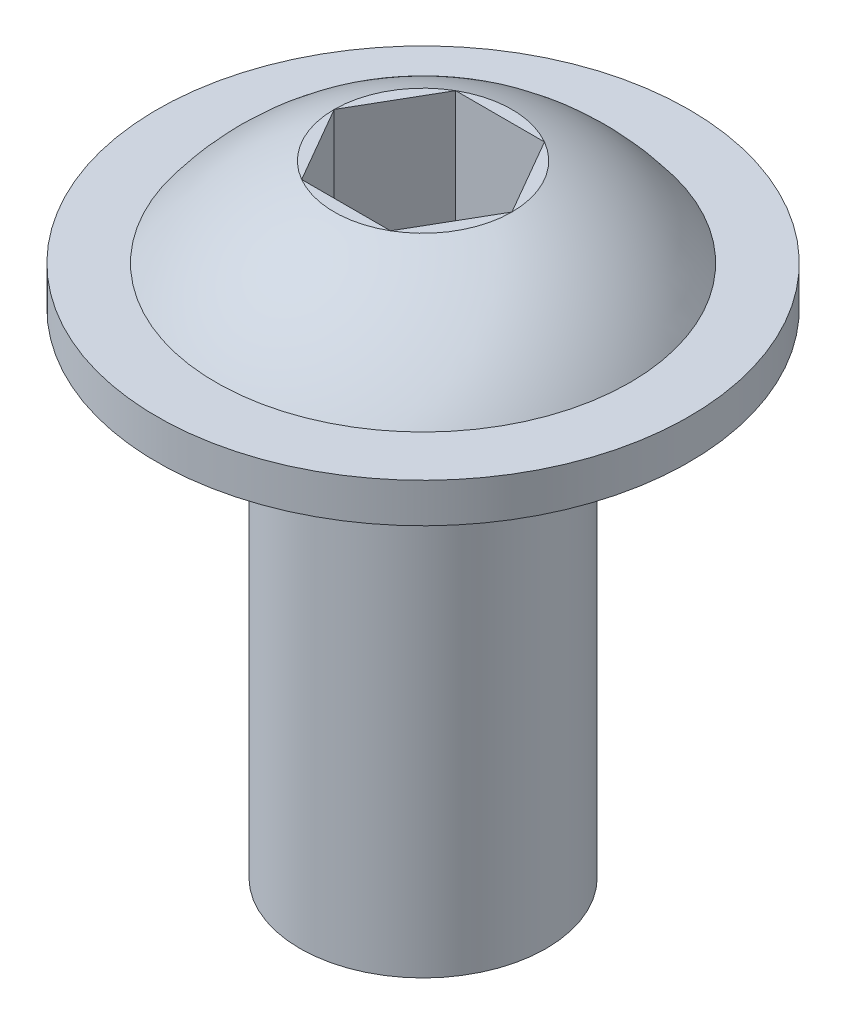
ISO-10303-21;
HEADER;
FILE_DESCRIPTION(('STEP AP214'),'2;1');
FILE_NAME('part.step','',(''),(''),'','','');
FILE_SCHEMA(('AUTOMOTIVE_DESIGN { 1 0 10303 214 1 1 1 1 }'));
ENDSEC;
DATA;
#1=APPLICATION_CONTEXT('core data for automotive mechanical design processes');
#2=APPLICATION_PROTOCOL_DEFINITION('international standard','automotive_design',2000,#1);
#3=PRODUCT_CONTEXT('',#1,'mechanical');
#4=PRODUCT('Part','Part','',(#3));
#5=PRODUCT_RELATED_PRODUCT_CATEGORY('part','',(#4));
#6=PRODUCT_DEFINITION_FORMATION('','',#4);
#7=PRODUCT_DEFINITION_CONTEXT('part definition',#1,'design');
#8=PRODUCT_DEFINITION('design','',#6,#7);
#9=PRODUCT_DEFINITION_SHAPE('','',#8);
#10=(LENGTH_UNIT() NAMED_UNIT(*) SI_UNIT(.MILLI.,.METRE.));
#11=(NAMED_UNIT(*) PLANE_ANGLE_UNIT() SI_UNIT($,.RADIAN.));
#12=(NAMED_UNIT(*) SI_UNIT($,.STERADIAN.) SOLID_ANGLE_UNIT());
#13=UNCERTAINTY_MEASURE_WITH_UNIT(LENGTH_MEASURE(1.E-05),#10,'distance_accuracy_value','');
#14=(GEOMETRIC_REPRESENTATION_CONTEXT(3) GLOBAL_UNCERTAINTY_ASSIGNED_CONTEXT((#13)) GLOBAL_UNIT_ASSIGNED_CONTEXT((#10,
#11,#12)) REPRESENTATION_CONTEXT('',''));
#15=CARTESIAN_POINT('',(0.,0.,0.));
#16=DIRECTION('',(0.,0.,1.));
#17=DIRECTION('',(1.,0.,0.));
#18=AXIS2_PLACEMENT_3D('',#15,#16,#17);
#19=CARTESIAN_POINT('',(2.29135888084633,16.002,0.));
#20=DIRECTION('',(0.,1.,0.));
#21=DIRECTION('',(0.,0.,1.));
#22=AXIS2_PLACEMENT_3D('',#19,#20,#21);
#23=PLANE('',#22);
#24=DIRECTION('',(0.5,0.,-0.866025403784439));
#25=VECTOR('',#24,1.);
#26=CARTESIAN_POINT('',(1.14567944042316,16.002,1.984375));
#27=LINE('',#26,#25);
#28=CARTESIAN_POINT('',(1.14567944042316,16.002,1.984375));
#29=VERTEX_POINT('',#28);
#30=CARTESIAN_POINT('',(2.29135888084633,16.002,0.));
#31=VERTEX_POINT('',#30);
#32=EDGE_CURVE('E47',#29,#31,#27,.T.);
#33=ORIENTED_EDGE('',*,*,#32,.F.);
#34=CARTESIAN_POINT('',(0.,16.002,0.));
#35=DIRECTION('',(0.,-1.,0.));
#36=DIRECTION('',(0.,0.,-1.));
#37=AXIS2_PLACEMENT_3D('',#34,#35,#36);
#38=CIRCLE('',#37,2.29135888084633);
#39=EDGE_CURVE('E144',#31,#29,#38,.T.);
#40=ORIENTED_EDGE('',*,*,#39,.F.);
#41=EDGE_LOOP('',(#33,#40));
#42=FACE_BOUND('',#41,.T.);
#43=ADVANCED_FACE('F32',(#42),#23,.T.);
#44=DIRECTION('',(1.,0.,0.));
#45=VECTOR('',#44,1.);
#46=CARTESIAN_POINT('',(-1.14567944042316,16.002,1.984375));
#47=LINE('',#46,#45);
#48=CARTESIAN_POINT('',(-1.14567944042316,16.002,1.984375));
#49=VERTEX_POINT('',#48);
#50=EDGE_CURVE('E130',#49,#29,#47,.T.);
#51=ORIENTED_EDGE('',*,*,#50,.F.);
#52=EDGE_CURVE('E218',#29,#49,#38,.T.);
#53=ORIENTED_EDGE('',*,*,#52,.F.);
#54=EDGE_LOOP('',(#51,#53));
#55=FACE_BOUND('',#54,.T.);
#56=ADVANCED_FACE('F171',(#55),#23,.T.);
#57=DIRECTION('',(0.5,0.,0.866025403784438));
#58=VECTOR('',#57,1.);
#59=CARTESIAN_POINT('',(-2.29135888084633,16.002,0.));
#60=LINE('',#59,#58);
#61=CARTESIAN_POINT('',(-2.29135888084633,16.002,0.));
#62=VERTEX_POINT('',#61);
#63=EDGE_CURVE('E128',#62,#49,#60,.T.);
#64=ORIENTED_EDGE('',*,*,#63,.F.);
#65=EDGE_CURVE('E219',#49,#62,#38,.T.);
#66=ORIENTED_EDGE('',*,*,#65,.F.);
#67=EDGE_LOOP('',(#64,#66));
#68=FACE_BOUND('',#67,.T.);
#69=ADVANCED_FACE('F178',(#68),#23,.T.);
#70=DIRECTION('',(-0.5,0.,0.866025403784439));
#71=VECTOR('',#70,1.);
#72=CARTESIAN_POINT('',(-1.14567944042316,16.002,-1.984375));
#73=LINE('',#72,#71);
#74=CARTESIAN_POINT('',(-1.14567944042316,16.002,-1.984375));
#75=VERTEX_POINT('',#74);
#76=EDGE_CURVE('E95',#75,#62,#73,.T.);
#77=ORIENTED_EDGE('',*,*,#76,.F.);
#78=EDGE_CURVE('E213',#62,#75,#38,.T.);
#79=ORIENTED_EDGE('',*,*,#78,.F.);
#80=EDGE_LOOP('',(#77,#79));
#81=FACE_BOUND('',#80,.T.);
#82=ADVANCED_FACE('F195',(#81),#23,.T.);
#83=DIRECTION('',(-1.,0.,0.));
#84=VECTOR('',#83,1.);
#85=CARTESIAN_POINT('',(1.14567944042316,16.002,-1.984375));
#86=LINE('',#85,#84);
#87=CARTESIAN_POINT('',(1.14567944042316,16.002,-1.984375));
#88=VERTEX_POINT('',#87);
#89=EDGE_CURVE('E124',#88,#75,#86,.T.);
#90=ORIENTED_EDGE('',*,*,#89,.F.);
#91=EDGE_CURVE('E134',#75,#88,#38,.T.);
#92=ORIENTED_EDGE('',*,*,#91,.F.);
#93=EDGE_LOOP('',(#90,#92));
#94=FACE_BOUND('',#93,.T.);
#95=ADVANCED_FACE('F186',(#94),#23,.T.);
#96=CARTESIAN_POINT('',(0.,0.,0.));
#97=DIRECTION('',(0.,-1.,0.));
#98=DIRECTION('',(0.,0.,-1.));
#99=AXIS2_PLACEMENT_3D('',#96,#97,#98);
#100=PLANE('',#99);
#101=CARTESIAN_POINT('',(0.,0.,0.));
#102=DIRECTION('',(0.,-1.,0.));
#103=DIRECTION('',(0.,0.,-1.));
#104=AXIS2_PLACEMENT_3D('',#101,#102,#103);
#105=CIRCLE('',#104,3.175);
#106=CARTESIAN_POINT('',(0.,0.,-3.175));
#107=VERTEX_POINT('',#106);
#108=EDGE_CURVE('E11',#107,#107,#105,.T.);
#109=ORIENTED_EDGE('',*,*,#108,.T.);
#110=EDGE_LOOP('',(#109));
#111=FACE_BOUND('',#110,.T.);
#112=ADVANCED_FACE('F34',(#111),#100,.T.);
#113=CARTESIAN_POINT('',(0.,0.,0.));
#114=DIRECTION('',(0.,-1.,0.));
#115=DIRECTION('',(0.,0.,-1.));
#116=AXIS2_PLACEMENT_3D('',#113,#114,#115);
#117=CYLINDRICAL_SURFACE('',#116,3.175);
#118=CARTESIAN_POINT('',(0.,12.7,0.));
#119=DIRECTION('',(0.,-1.,0.));
#120=DIRECTION('',(0.,0.,-1.));
#121=AXIS2_PLACEMENT_3D('',#118,#119,#120);
#122=CIRCLE('',#121,3.175);
#123=CARTESIAN_POINT('',(0.,12.7,-3.175));
#124=VERTEX_POINT('',#123);
#125=EDGE_CURVE('E40',#124,#124,#122,.T.);
#126=ORIENTED_EDGE('',*,*,#125,.T.);
#127=EDGE_LOOP('',(#126));
#128=FACE_BOUND('',#127,.T.);
#129=ORIENTED_EDGE('',*,*,#108,.F.);
#130=EDGE_LOOP('',(#129));
#131=FACE_BOUND('',#130,.T.);
#132=ADVANCED_FACE('F155',(#128,#131),#117,.T.);
#133=CARTESIAN_POINT('',(3.175,12.7,0.));
#134=DIRECTION('',(0.,-1.,0.));
#135=DIRECTION('',(0.,0.,-1.));
#136=AXIS2_PLACEMENT_3D('',#133,#134,#135);
#137=PLANE('',#136);
#138=CARTESIAN_POINT('',(0.,12.7,0.));
#139=DIRECTION('',(0.,-1.,0.));
#140=DIRECTION('',(0.,0.,-1.));
#141=AXIS2_PLACEMENT_3D('',#138,#139,#140);
#142=CIRCLE('',#141,6.858);
#143=CARTESIAN_POINT('',(0.,12.7,-6.858));
#144=VERTEX_POINT('',#143);
#145=EDGE_CURVE('E150',#144,#144,#142,.T.);
#146=ORIENTED_EDGE('',*,*,#145,.T.);
#147=EDGE_LOOP('',(#146));
#148=FACE_BOUND('',#147,.T.);
#149=ORIENTED_EDGE('',*,*,#125,.F.);
#150=EDGE_LOOP('',(#149));
#151=FACE_BOUND('',#150,.T.);
#152=ADVANCED_FACE('F158',(#148,#151),#137,.T.);
#153=CARTESIAN_POINT('',(0.,0.,0.));
#154=DIRECTION('',(0.,-1.,0.));
#155=DIRECTION('',(0.,0.,-1.));
#156=AXIS2_PLACEMENT_3D('',#153,#154,#155);
#157=CYLINDRICAL_SURFACE('',#156,6.858);
#158=CARTESIAN_POINT('',(0.,13.716,0.));
#159=DIRECTION('',(0.,-1.,0.));
#160=DIRECTION('',(0.,0.,-1.));
#161=AXIS2_PLACEMENT_3D('',#158,#159,#160);
#162=CIRCLE('',#161,6.858);
#163=CARTESIAN_POINT('',(0.,13.716,-6.858));
#164=VERTEX_POINT('',#163);
#165=EDGE_CURVE('E147',#164,#164,#162,.T.);
#166=ORIENTED_EDGE('',*,*,#165,.T.);
#167=EDGE_LOOP('',(#166));
#168=FACE_BOUND('',#167,.T.);
#169=ORIENTED_EDGE('',*,*,#145,.F.);
#170=EDGE_LOOP('',(#169));
#171=FACE_BOUND('',#170,.T.);
#172=ADVANCED_FACE('F160',(#168,#171),#157,.T.);
#173=CARTESIAN_POINT('',(6.858,13.716,0.));
#174=DIRECTION('',(0.,1.,0.));
#175=DIRECTION('',(0.,0.,1.));
#176=AXIS2_PLACEMENT_3D('',#173,#174,#175);
#177=PLANE('',#176);
#178=CARTESIAN_POINT('',(0.,13.716,0.));
#179=DIRECTION('',(0.,-1.,0.));
#180=DIRECTION('',(0.,0.,-1.));
#181=AXIS2_PLACEMENT_3D('',#178,#179,#180);
#182=CIRCLE('',#181,5.334);
#183=CARTESIAN_POINT('',(0.,13.716,-5.334));
#184=VERTEX_POINT('',#183);
#185=EDGE_CURVE('E143',#184,#184,#182,.T.);
#186=ORIENTED_EDGE('',*,*,#185,.T.);
#187=EDGE_LOOP('',(#186));
#188=FACE_BOUND('',#187,.T.);
#189=ORIENTED_EDGE('',*,*,#165,.F.);
#190=EDGE_LOOP('',(#189));
#191=FACE_BOUND('',#190,.T.);
#192=ADVANCED_FACE('F167',(#188,#191),#177,.T.);
#193=CARTESIAN_POINT('',(0.,9.78436516203704,0.));
#194=DIRECTION('',(0.,-1.,0.));
#195=DIRECTION('',(1.,0.,0.));
#196=AXIS2_PLACEMENT_3D('',#193,#194,#195);
#197=SPHERICAL_SURFACE('',#196,6.62640992537317);
#198=EDGE_CURVE('E140',#88,#31,#38,.T.);
#199=ORIENTED_EDGE('',*,*,#198,.T.);
#200=ORIENTED_EDGE('',*,*,#39,.T.);
#201=ORIENTED_EDGE('',*,*,#52,.T.);
#202=ORIENTED_EDGE('',*,*,#65,.T.);
#203=ORIENTED_EDGE('',*,*,#78,.T.);
#204=ORIENTED_EDGE('',*,*,#91,.T.);
#205=EDGE_LOOP('',(#199,#200,#201,#202,#203,#204));
#206=FACE_BOUND('',#205,.T.);
#207=ORIENTED_EDGE('',*,*,#185,.F.);
#208=EDGE_LOOP('',(#207));
#209=FACE_BOUND('',#208,.T.);
#210=ADVANCED_FACE('F184',(#206,#209),#197,.T.);
#211=DIRECTION('',(-0.5,0.,-0.866025403784439));
#212=VECTOR('',#211,1.);
#213=CARTESIAN_POINT('',(2.29135888084633,16.002,0.));
#214=LINE('',#213,#212);
#215=EDGE_CURVE('E121',#31,#88,#214,.T.);
#216=ORIENTED_EDGE('',*,*,#215,.F.);
#217=ORIENTED_EDGE('',*,*,#198,.F.);
#218=EDGE_LOOP('',(#216,#217));
#219=FACE_BOUND('',#218,.T.);
#220=ADVANCED_FACE('F174',(#219),#23,.T.);
#221=CARTESIAN_POINT('',(1.14567944042316,12.827,1.984375));
#222=DIRECTION('',(0.866025403784439,0.,0.5));
#223=DIRECTION('',(0.5,0.,-0.866025403784439));
#224=AXIS2_PLACEMENT_3D('',#221,#222,#223);
#225=PLANE('',#224);
#226=ORIENTED_EDGE('',*,*,#32,.T.);
#227=DIRECTION('',(0.,1.,0.));
#228=VECTOR('',#227,1.);
#229=CARTESIAN_POINT('',(2.29135888084633,12.827,0.));
#230=LINE('',#229,#228);
#231=CARTESIAN_POINT('',(2.29135888084633,12.827,0.));
#232=VERTEX_POINT('',#231);
#233=EDGE_CURVE('E77',#232,#31,#230,.T.);
#234=ORIENTED_EDGE('',*,*,#233,.F.);
#235=DIRECTION('',(0.5,0.,-0.866025403784439));
#236=VECTOR('',#235,1.);
#237=CARTESIAN_POINT('',(1.14567944042316,12.827,1.984375));
#238=LINE('',#237,#236);
#239=CARTESIAN_POINT('',(1.14567944042316,12.827,1.984375));
#240=VERTEX_POINT('',#239);
#241=EDGE_CURVE('E132',#240,#232,#238,.T.);
#242=ORIENTED_EDGE('',*,*,#241,.F.);
#243=DIRECTION('',(0.,1.,0.));
#244=VECTOR('',#243,1.);
#245=CARTESIAN_POINT('',(1.14567944042316,12.827,1.984375));
#246=LINE('',#245,#244);
#247=EDGE_CURVE('E55',#240,#29,#246,.T.);
#248=ORIENTED_EDGE('',*,*,#247,.T.);
#249=EDGE_LOOP('',(#226,#234,#242,#248));
#250=FACE_BOUND('',#249,.T.);
#251=ADVANCED_FACE('F183',(#250),#225,.F.);
#252=CARTESIAN_POINT('',(-1.14567944042316,12.827,1.984375));
#253=DIRECTION('',(0.,0.,1.));
#254=DIRECTION('',(1.,0.,0.));
#255=AXIS2_PLACEMENT_3D('',#252,#253,#254);
#256=PLANE('',#255);
#257=ORIENTED_EDGE('',*,*,#50,.T.);
#258=ORIENTED_EDGE('',*,*,#247,.F.);
#259=DIRECTION('',(1.,0.,0.));
#260=VECTOR('',#259,1.);
#261=CARTESIAN_POINT('',(-1.14567944042316,12.827,1.984375));
#262=LINE('',#261,#260);
#263=CARTESIAN_POINT('',(-1.14567944042316,12.827,1.984375));
#264=VERTEX_POINT('',#263);
#265=EDGE_CURVE('E107',#264,#240,#262,.T.);
#266=ORIENTED_EDGE('',*,*,#265,.F.);
#267=DIRECTION('',(0.,1.,0.));
#268=VECTOR('',#267,1.);
#269=CARTESIAN_POINT('',(-1.14567944042316,12.827,1.984375));
#270=LINE('',#269,#268);
#271=EDGE_CURVE('E99',#264,#49,#270,.T.);
#272=ORIENTED_EDGE('',*,*,#271,.T.);
#273=EDGE_LOOP('',(#257,#258,#266,#272));
#274=FACE_BOUND('',#273,.T.);
#275=ADVANCED_FACE('F191',(#274),#256,.F.);
#276=CARTESIAN_POINT('',(-2.29135888084633,12.827,0.));
#277=DIRECTION('',(-0.866025403784438,0.,0.5));
#278=DIRECTION('',(0.5,0.,0.866025403784439));
#279=AXIS2_PLACEMENT_3D('',#276,#277,#278);
#280=PLANE('',#279);
#281=ORIENTED_EDGE('',*,*,#63,.T.);
#282=ORIENTED_EDGE('',*,*,#271,.F.);
#283=DIRECTION('',(0.5,0.,0.866025403784438));
#284=VECTOR('',#283,1.);
#285=CARTESIAN_POINT('',(-2.29135888084633,12.827,0.));
#286=LINE('',#285,#284);
#287=CARTESIAN_POINT('',(-2.29135888084633,12.827,0.));
#288=VERTEX_POINT('',#287);
#289=EDGE_CURVE('E103',#288,#264,#286,.T.);
#290=ORIENTED_EDGE('',*,*,#289,.F.);
#291=DIRECTION('',(0.,1.,0.));
#292=VECTOR('',#291,1.);
#293=CARTESIAN_POINT('',(-2.29135888084633,12.827,0.));
#294=LINE('',#293,#292);
#295=EDGE_CURVE('E88',#288,#62,#294,.T.);
#296=ORIENTED_EDGE('',*,*,#295,.T.);
#297=EDGE_LOOP('',(#281,#282,#290,#296));
#298=FACE_BOUND('',#297,.T.);
#299=ADVANCED_FACE('F104',(#298),#280,.F.);
#300=CARTESIAN_POINT('',(-1.14567944042316,12.827,-1.984375));
#301=DIRECTION('',(-0.866025403784439,0.,-0.5));
#302=DIRECTION('',(-0.5,0.,0.866025403784439));
#303=AXIS2_PLACEMENT_3D('',#300,#301,#302);
#304=PLANE('',#303);
#305=ORIENTED_EDGE('',*,*,#76,.T.);
#306=ORIENTED_EDGE('',*,*,#295,.F.);
#307=DIRECTION('',(-0.5,0.,0.866025403784439));
#308=VECTOR('',#307,1.);
#309=CARTESIAN_POINT('',(-1.14567944042316,12.827,-1.984375));
#310=LINE('',#309,#308);
#311=CARTESIAN_POINT('',(-1.14567944042316,12.827,-1.984375));
#312=VERTEX_POINT('',#311);
#313=EDGE_CURVE('E92',#312,#288,#310,.T.);
#314=ORIENTED_EDGE('',*,*,#313,.F.);
#315=DIRECTION('',(0.,1.,0.));
#316=VECTOR('',#315,1.);
#317=CARTESIAN_POINT('',(-1.14567944042316,12.827,-1.984375));
#318=LINE('',#317,#316);
#319=EDGE_CURVE('E100',#312,#75,#318,.T.);
#320=ORIENTED_EDGE('',*,*,#319,.T.);
#321=EDGE_LOOP('',(#305,#306,#314,#320));
#322=FACE_BOUND('',#321,.T.);
#323=ADVANCED_FACE('F90',(#322),#304,.F.);
#324=CARTESIAN_POINT('',(1.14567944042316,12.827,-1.984375));
#325=DIRECTION('',(0.,0.,-1.));
#326=DIRECTION('',(-1.,0.,0.));
#327=AXIS2_PLACEMENT_3D('',#324,#325,#326);
#328=PLANE('',#327);
#329=ORIENTED_EDGE('',*,*,#89,.T.);
#330=ORIENTED_EDGE('',*,*,#319,.F.);
#331=DIRECTION('',(-1.,0.,0.));
#332=VECTOR('',#331,1.);
#333=CARTESIAN_POINT('',(1.14567944042316,12.827,-1.984375));
#334=LINE('',#333,#332);
#335=CARTESIAN_POINT('',(1.14567944042316,12.827,-1.984375));
#336=VERTEX_POINT('',#335);
#337=EDGE_CURVE('E113',#336,#312,#334,.T.);
#338=ORIENTED_EDGE('',*,*,#337,.F.);
#339=DIRECTION('',(0.,1.,0.));
#340=VECTOR('',#339,1.);
#341=CARTESIAN_POINT('',(1.14567944042316,12.827,-1.984375));
#342=LINE('',#341,#340);
#343=EDGE_CURVE('E137',#336,#88,#342,.T.);
#344=ORIENTED_EDGE('',*,*,#343,.T.);
#345=EDGE_LOOP('',(#329,#330,#338,#344));
#346=FACE_BOUND('',#345,.T.);
#347=ADVANCED_FACE('F225',(#346),#328,.F.);
#348=CARTESIAN_POINT('',(2.29135888084633,12.827,0.));
#349=DIRECTION('',(0.866025403784439,0.,-0.5));
#350=DIRECTION('',(-0.5,0.,-0.866025403784439));
#351=AXIS2_PLACEMENT_3D('',#348,#349,#350);
#352=PLANE('',#351);
#353=ORIENTED_EDGE('',*,*,#215,.T.);
#354=ORIENTED_EDGE('',*,*,#343,.F.);
#355=DIRECTION('',(-0.5,0.,-0.866025403784439));
#356=VECTOR('',#355,1.);
#357=CARTESIAN_POINT('',(2.29135888084633,12.827,0.));
#358=LINE('',#357,#356);
#359=EDGE_CURVE('E115',#232,#336,#358,.T.);
#360=ORIENTED_EDGE('',*,*,#359,.F.);
#361=ORIENTED_EDGE('',*,*,#233,.T.);
#362=EDGE_LOOP('',(#353,#354,#360,#361));
#363=FACE_BOUND('',#362,.T.);
#364=ADVANCED_FACE('F224',(#363),#352,.F.);
#365=CARTESIAN_POINT('',(0.,12.827,3.96875));
#366=DIRECTION('',(0.,-1.,0.));
#367=DIRECTION('',(0.,0.,-1.));
#368=AXIS2_PLACEMENT_3D('',#365,#366,#367);
#369=PLANE('',#368);
#370=ORIENTED_EDGE('',*,*,#241,.T.);
#371=ORIENTED_EDGE('',*,*,#359,.T.);
#372=ORIENTED_EDGE('',*,*,#337,.T.);
#373=ORIENTED_EDGE('',*,*,#313,.T.);
#374=ORIENTED_EDGE('',*,*,#289,.T.);
#375=ORIENTED_EDGE('',*,*,#265,.T.);
#376=EDGE_LOOP('',(#370,#371,#372,#373,#374,#375));
#377=FACE_BOUND('',#376,.T.);
#378=ADVANCED_FACE('F110',(#377),#369,.F.);
#379=CLOSED_SHELL('',(#43,#56,#69,#82,#95,#112,#132,#152,#172,#192,#210,#220,#251,#275,#299,
#323,#347,#364,#378));
#380=MANIFOLD_SOLID_BREP('B2',#379);
#381=ADVANCED_BREP_SHAPE_REPRESENTATION('',(#18,#380),#14);
#382=SHAPE_DEFINITION_REPRESENTATION(#9,#381);
ENDSEC;
END-ISO-10303-21;
